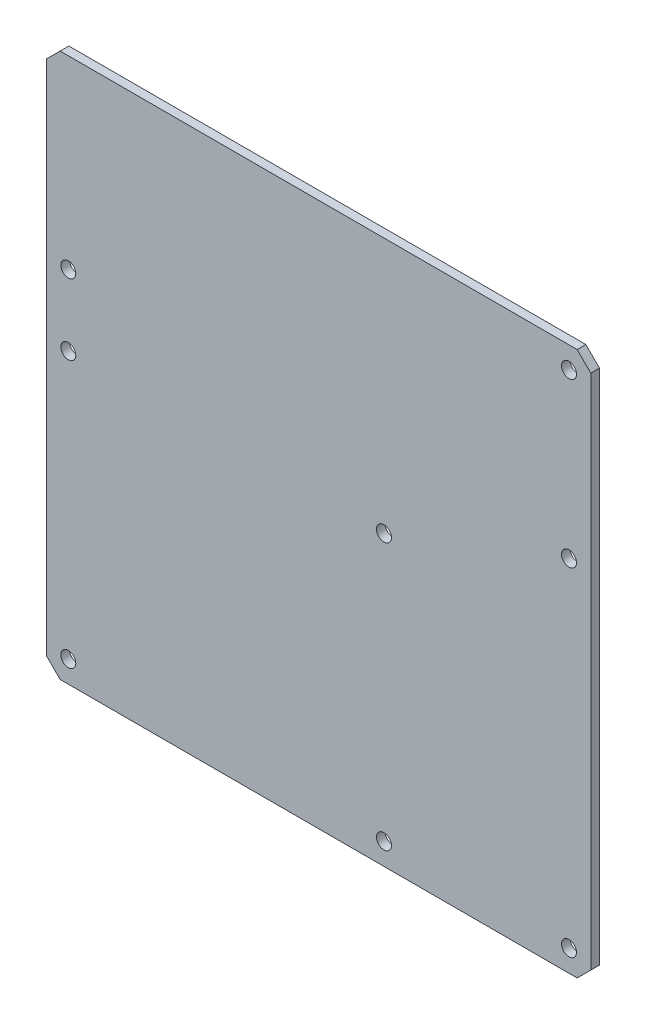
ISO-10303-21;
HEADER;
FILE_DESCRIPTION(('STEP AP214'),'2;1');
FILE_NAME('part.step','',(''),(''),'','','');
FILE_SCHEMA(('AUTOMOTIVE_DESIGN { 1 0 10303 214 1 1 1 1 }'));
ENDSEC;
DATA;
#1=APPLICATION_CONTEXT('core data for automotive mechanical design processes');
#2=APPLICATION_PROTOCOL_DEFINITION('international standard','automotive_design',2000,#1);
#3=PRODUCT_CONTEXT('',#1,'mechanical');
#4=PRODUCT('Part','Part','',(#3));
#5=PRODUCT_RELATED_PRODUCT_CATEGORY('part','',(#4));
#6=PRODUCT_DEFINITION_FORMATION('','',#4);
#7=PRODUCT_DEFINITION_CONTEXT('part definition',#1,'design');
#8=PRODUCT_DEFINITION('design','',#6,#7);
#9=PRODUCT_DEFINITION_SHAPE('','',#8);
#10=(LENGTH_UNIT() NAMED_UNIT(*) SI_UNIT(.MILLI.,.METRE.));
#11=(NAMED_UNIT(*) PLANE_ANGLE_UNIT() SI_UNIT($,.RADIAN.));
#12=(NAMED_UNIT(*) SI_UNIT($,.STERADIAN.) SOLID_ANGLE_UNIT());
#13=UNCERTAINTY_MEASURE_WITH_UNIT(LENGTH_MEASURE(1.E-05),#10,'distance_accuracy_value','');
#14=(GEOMETRIC_REPRESENTATION_CONTEXT(3) GLOBAL_UNCERTAINTY_ASSIGNED_CONTEXT((#13)) GLOBAL_UNIT_ASSIGNED_CONTEXT((#10,
#11,#12)) REPRESENTATION_CONTEXT('',''));
#15=CARTESIAN_POINT('',(0.,0.,0.));
#16=DIRECTION('',(0.,0.,1.));
#17=DIRECTION('',(1.,0.,0.));
#18=AXIS2_PLACEMENT_3D('',#15,#16,#17);
#19=CARTESIAN_POINT('',(41.6323670908377,0.,1.6));
#20=DIRECTION('',(1.,0.,0.));
#21=DIRECTION('',(0.,1.,0.));
#22=AXIS2_PLACEMENT_3D('',#19,#20,#21);
#23=PLANE('',#22);
#24=DIRECTION('',(0.,-1.,0.));
#25=VECTOR('',#24,1.);
#26=CARTESIAN_POINT('',(41.6323670908377,0.,0.));
#27=LINE('',#26,#25);
#28=CARTESIAN_POINT('',(41.6323670908377,45.7222222222222,0.));
#29=VERTEX_POINT('',#28);
#30=CARTESIAN_POINT('',(41.6323670908377,-49.2777777777778,0.));
#31=VERTEX_POINT('',#30);
#32=EDGE_CURVE('E229',#29,#31,#27,.T.);
#33=ORIENTED_EDGE('',*,*,#32,.F.);
#34=DIRECTION('',(0.,0.,-1.));
#35=VECTOR('',#34,1.);
#36=CARTESIAN_POINT('',(41.6323670908377,45.7222222222222,1.6));
#37=LINE('',#36,#35);
#38=CARTESIAN_POINT('',(41.6323670908377,45.7222222222222,1.6));
#39=VERTEX_POINT('',#38);
#40=EDGE_CURVE('E12',#39,#29,#37,.T.);
#41=ORIENTED_EDGE('',*,*,#40,.F.);
#42=DIRECTION('',(0.,-1.,0.));
#43=VECTOR('',#42,1.);
#44=CARTESIAN_POINT('',(41.6323670908377,0.,1.6));
#45=LINE('',#44,#43);
#46=CARTESIAN_POINT('',(41.6323670908377,-49.2777777777778,1.6));
#47=VERTEX_POINT('',#46);
#48=EDGE_CURVE('E312',#39,#47,#45,.T.);
#49=ORIENTED_EDGE('',*,*,#48,.T.);
#50=DIRECTION('',(0.,0.,-1.));
#51=VECTOR('',#50,1.);
#52=CARTESIAN_POINT('',(41.6323670908377,-49.2777777777778,1.6));
#53=LINE('',#52,#51);
#54=EDGE_CURVE('E114',#47,#31,#53,.T.);
#55=ORIENTED_EDGE('',*,*,#54,.T.);
#56=EDGE_LOOP('',(#33,#41,#49,#55));
#57=FACE_BOUND('',#56,.T.);
#58=ADVANCED_FACE('F48',(#57),#23,.T.);
#59=CARTESIAN_POINT('',(43.6772946565299,43.67729465653,1.6));
#60=DIRECTION('',(-0.707106781186546,-0.707106781186548,0.));
#61=DIRECTION('',(0.707106781186549,-0.707106781186547,0.));
#62=AXIS2_PLACEMENT_3D('',#59,#60,#61);
#63=PLANE('',#62);
#64=DIRECTION('',(-0.707106781186549,0.707106781186547,0.));
#65=VECTOR('',#64,1.);
#66=CARTESIAN_POINT('',(43.6772946565299,43.67729465653,0.));
#67=LINE('',#66,#65);
#68=CARTESIAN_POINT('',(39.1323670908377,48.2222222222222,0.));
#69=VERTEX_POINT('',#68);
#70=EDGE_CURVE('E233',#29,#69,#67,.T.);
#71=ORIENTED_EDGE('',*,*,#70,.T.);
#72=DIRECTION('',(0.,0.,-1.));
#73=VECTOR('',#72,1.);
#74=CARTESIAN_POINT('',(39.1323670908377,48.2222222222222,1.6));
#75=LINE('',#74,#73);
#76=CARTESIAN_POINT('',(39.1323670908377,48.2222222222222,1.6));
#77=VERTEX_POINT('',#76);
#78=EDGE_CURVE('E59',#77,#69,#75,.T.);
#79=ORIENTED_EDGE('',*,*,#78,.F.);
#80=DIRECTION('',(-0.707106781186549,0.707106781186547,0.));
#81=VECTOR('',#80,1.);
#82=CARTESIAN_POINT('',(43.6772946565299,43.67729465653,1.6));
#83=LINE('',#82,#81);
#84=EDGE_CURVE('E307',#39,#77,#83,.T.);
#85=ORIENTED_EDGE('',*,*,#84,.F.);
#86=ORIENTED_EDGE('',*,*,#40,.T.);
#87=EDGE_LOOP('',(#71,#79,#85,#86));
#88=FACE_BOUND('',#87,.T.);
#89=ADVANCED_FACE('F285',(#88),#63,.F.);
#90=CARTESIAN_POINT('',(0.,48.2222222222222,1.6));
#91=DIRECTION('',(0.,1.,0.));
#92=DIRECTION('',(0.,0.,1.));
#93=AXIS2_PLACEMENT_3D('',#90,#91,#92);
#94=PLANE('',#93);
#95=DIRECTION('',(1.,0.,0.));
#96=VECTOR('',#95,1.);
#97=CARTESIAN_POINT('',(0.,48.2222222222222,0.));
#98=LINE('',#97,#96);
#99=CARTESIAN_POINT('',(-55.8676329091623,48.2222222222222,0.));
#100=VERTEX_POINT('',#99);
#101=EDGE_CURVE('E279',#100,#69,#98,.T.);
#102=ORIENTED_EDGE('',*,*,#101,.F.);
#103=DIRECTION('',(0.,0.,-1.));
#104=VECTOR('',#103,1.);
#105=CARTESIAN_POINT('',(-55.8676329091623,48.2222222222222,1.6));
#106=LINE('',#105,#104);
#107=CARTESIAN_POINT('',(-55.8676329091623,48.2222222222222,1.6));
#108=VERTEX_POINT('',#107);
#109=EDGE_CURVE('E263',#108,#100,#106,.T.);
#110=ORIENTED_EDGE('',*,*,#109,.F.);
#111=DIRECTION('',(1.,0.,0.));
#112=VECTOR('',#111,1.);
#113=CARTESIAN_POINT('',(0.,48.2222222222222,1.6));
#114=LINE('',#113,#112);
#115=EDGE_CURVE('E282',#108,#77,#114,.T.);
#116=ORIENTED_EDGE('',*,*,#115,.T.);
#117=ORIENTED_EDGE('',*,*,#78,.T.);
#118=EDGE_LOOP('',(#102,#110,#116,#117));
#119=FACE_BOUND('',#118,.T.);
#120=ADVANCED_FACE('F277',(#119),#94,.T.);
#121=CARTESIAN_POINT('',(-52.0449275656923,52.0449275656923,1.6));
#122=DIRECTION('',(-0.707106781186548,0.707106781186548,0.));
#123=DIRECTION('',(-0.707106781186548,-0.707106781186548,0.));
#124=AXIS2_PLACEMENT_3D('',#121,#122,#123);
#125=PLANE('',#124);
#126=DIRECTION('',(0.707106781186548,0.707106781186548,0.));
#127=VECTOR('',#126,1.);
#128=CARTESIAN_POINT('',(-52.0449275656923,52.0449275656923,0.));
#129=LINE('',#128,#127);
#130=CARTESIAN_POINT('',(-58.3676329091623,45.7222222222222,0.));
#131=VERTEX_POINT('',#130);
#132=EDGE_CURVE('E289',#131,#100,#129,.T.);
#133=ORIENTED_EDGE('',*,*,#132,.F.);
#134=DIRECTION('',(0.,0.,-1.));
#135=VECTOR('',#134,1.);
#136=CARTESIAN_POINT('',(-58.3676329091623,45.7222222222222,1.6));
#137=LINE('',#136,#135);
#138=CARTESIAN_POINT('',(-58.3676329091623,45.7222222222222,1.6));
#139=VERTEX_POINT('',#138);
#140=EDGE_CURVE('E266',#139,#131,#137,.T.);
#141=ORIENTED_EDGE('',*,*,#140,.F.);
#142=DIRECTION('',(0.707106781186548,0.707106781186548,0.));
#143=VECTOR('',#142,1.);
#144=CARTESIAN_POINT('',(-52.0449275656923,52.0449275656923,1.6));
#145=LINE('',#144,#143);
#146=EDGE_CURVE('E164',#139,#108,#145,.T.);
#147=ORIENTED_EDGE('',*,*,#146,.T.);
#148=ORIENTED_EDGE('',*,*,#109,.T.);
#149=EDGE_LOOP('',(#133,#141,#147,#148));
#150=FACE_BOUND('',#149,.T.);
#151=ADVANCED_FACE('F305',(#150),#125,.T.);
#152=CARTESIAN_POINT('',(-58.3676329091623,0.,1.6));
#153=DIRECTION('',(1.,0.,0.));
#154=DIRECTION('',(0.,0.,-1.));
#155=AXIS2_PLACEMENT_3D('',#152,#153,#154);
#156=PLANE('',#155);
#157=DIRECTION('',(0.,-1.,0.));
#158=VECTOR('',#157,1.);
#159=CARTESIAN_POINT('',(-58.3676329091623,0.,0.));
#160=LINE('',#159,#158);
#161=CARTESIAN_POINT('',(-58.3676329091623,-49.2777777777778,0.));
#162=VERTEX_POINT('',#161);
#163=EDGE_CURVE('E292',#131,#162,#160,.T.);
#164=ORIENTED_EDGE('',*,*,#163,.T.);
#165=DIRECTION('',(0.,0.,-1.));
#166=VECTOR('',#165,1.);
#167=CARTESIAN_POINT('',(-58.3676329091623,-49.2777777777778,1.6));
#168=LINE('',#167,#166);
#169=CARTESIAN_POINT('',(-58.3676329091623,-49.2777777777778,1.6));
#170=VERTEX_POINT('',#169);
#171=EDGE_CURVE('E148',#170,#162,#168,.T.);
#172=ORIENTED_EDGE('',*,*,#171,.F.);
#173=DIRECTION('',(0.,-1.,0.));
#174=VECTOR('',#173,1.);
#175=CARTESIAN_POINT('',(-58.3676329091623,0.,1.6));
#176=LINE('',#175,#174);
#177=EDGE_CURVE('E159',#139,#170,#176,.T.);
#178=ORIENTED_EDGE('',*,*,#177,.F.);
#179=ORIENTED_EDGE('',*,*,#140,.T.);
#180=EDGE_LOOP('',(#164,#172,#178,#179));
#181=FACE_BOUND('',#180,.T.);
#182=ADVANCED_FACE('F466',(#181),#156,.F.);
#183=CARTESIAN_POINT('',(-53.82270534347,-53.82270534347,1.6));
#184=DIRECTION('',(-0.707106781186548,-0.707106781186548,0.));
#185=DIRECTION('',(0.707106781186548,-0.707106781186548,0.));
#186=AXIS2_PLACEMENT_3D('',#183,#184,#185);
#187=PLANE('',#186);
#188=DIRECTION('',(-0.707106781186548,0.707106781186548,0.));
#189=VECTOR('',#188,1.);
#190=CARTESIAN_POINT('',(-53.82270534347,-53.82270534347,0.));
#191=LINE('',#190,#189);
#192=CARTESIAN_POINT('',(-55.8676329091623,-51.7777777777778,0.));
#193=VERTEX_POINT('',#192);
#194=EDGE_CURVE('E144',#193,#162,#191,.T.);
#195=ORIENTED_EDGE('',*,*,#194,.F.);
#196=DIRECTION('',(0.,0.,-1.));
#197=VECTOR('',#196,1.);
#198=CARTESIAN_POINT('',(-55.8676329091623,-51.7777777777778,1.6));
#199=LINE('',#198,#197);
#200=CARTESIAN_POINT('',(-55.8676329091623,-51.7777777777778,1.6));
#201=VERTEX_POINT('',#200);
#202=EDGE_CURVE('E138',#201,#193,#199,.T.);
#203=ORIENTED_EDGE('',*,*,#202,.F.);
#204=DIRECTION('',(-0.707106781186548,0.707106781186548,0.));
#205=VECTOR('',#204,1.);
#206=CARTESIAN_POINT('',(-53.82270534347,-53.82270534347,1.6));
#207=LINE('',#206,#205);
#208=EDGE_CURVE('E142',#201,#170,#207,.T.);
#209=ORIENTED_EDGE('',*,*,#208,.T.);
#210=ORIENTED_EDGE('',*,*,#171,.T.);
#211=EDGE_LOOP('',(#195,#203,#209,#210));
#212=FACE_BOUND('',#211,.T.);
#213=ADVANCED_FACE('F140',(#212),#187,.T.);
#214=CARTESIAN_POINT('',(0.,-51.7777777777778,1.6));
#215=DIRECTION('',(0.,1.,0.));
#216=DIRECTION('',(0.,0.,1.));
#217=AXIS2_PLACEMENT_3D('',#214,#215,#216);
#218=PLANE('',#217);
#219=DIRECTION('',(1.,0.,0.));
#220=VECTOR('',#219,1.);
#221=CARTESIAN_POINT('',(0.,-51.7777777777778,0.));
#222=LINE('',#221,#220);
#223=CARTESIAN_POINT('',(39.1323670908377,-51.7777777777778,0.));
#224=VERTEX_POINT('',#223);
#225=EDGE_CURVE('E241',#193,#224,#222,.T.);
#226=ORIENTED_EDGE('',*,*,#225,.T.);
#227=DIRECTION('',(0.,0.,-1.));
#228=VECTOR('',#227,1.);
#229=CARTESIAN_POINT('',(39.1323670908377,-51.7777777777778,1.6));
#230=LINE('',#229,#228);
#231=CARTESIAN_POINT('',(39.1323670908377,-51.7777777777778,1.6));
#232=VERTEX_POINT('',#231);
#233=EDGE_CURVE('E149',#232,#224,#230,.T.);
#234=ORIENTED_EDGE('',*,*,#233,.F.);
#235=DIRECTION('',(1.,0.,0.));
#236=VECTOR('',#235,1.);
#237=CARTESIAN_POINT('',(0.,-51.7777777777778,1.6));
#238=LINE('',#237,#236);
#239=EDGE_CURVE('E152',#201,#232,#238,.T.);
#240=ORIENTED_EDGE('',*,*,#239,.F.);
#241=ORIENTED_EDGE('',*,*,#202,.T.);
#242=EDGE_LOOP('',(#226,#234,#240,#241));
#243=FACE_BOUND('',#242,.T.);
#244=ADVANCED_FACE('F153',(#243),#218,.F.);
#245=CARTESIAN_POINT('',(-54.3676329091623,-47.7777777777778,1.6));
#246=DIRECTION('',(0.,0.,-1.));
#247=DIRECTION('',(-1.,0.,0.));
#248=AXIS2_PLACEMENT_3D('',#245,#246,#247);
#249=CYLINDRICAL_SURFACE('',#248,1.375);
#250=CARTESIAN_POINT('',(-54.3676329091623,-47.7777777777778,1.6));
#251=DIRECTION('',(0.,0.,1.));
#252=DIRECTION('',(1.,0.,0.));
#253=AXIS2_PLACEMENT_3D('',#250,#251,#252);
#254=CIRCLE('',#253,1.375);
#255=CARTESIAN_POINT('',(-52.9926329091623,-47.7777777777778,1.6));
#256=VERTEX_POINT('',#255);
#257=EDGE_CURVE('E326',#256,#256,#254,.T.);
#258=ORIENTED_EDGE('',*,*,#257,.T.);
#259=EDGE_LOOP('',(#258));
#260=FACE_BOUND('',#259,.T.);
#261=CARTESIAN_POINT('',(-54.3676329091623,-47.7777777777778,0.));
#262=DIRECTION('',(0.,0.,1.));
#263=DIRECTION('',(1.,0.,0.));
#264=AXIS2_PLACEMENT_3D('',#261,#262,#263);
#265=CIRCLE('',#264,1.375);
#266=CARTESIAN_POINT('',(-52.9926329091623,-47.7777777777778,0.));
#267=VERTEX_POINT('',#266);
#268=EDGE_CURVE('E224',#267,#267,#265,.T.);
#269=ORIENTED_EDGE('',*,*,#268,.F.);
#270=EDGE_LOOP('',(#269));
#271=FACE_BOUND('',#270,.T.);
#272=ADVANCED_FACE('F392',(#260,#271),#249,.F.);
#273=CARTESIAN_POINT('',(3.63236709083768,-47.7777777777778,1.6));
#274=DIRECTION('',(0.,0.,-1.));
#275=DIRECTION('',(-1.,0.,0.));
#276=AXIS2_PLACEMENT_3D('',#273,#274,#275);
#277=CYLINDRICAL_SURFACE('',#276,1.375);
#278=CARTESIAN_POINT('',(3.63236709083768,-47.7777777777778,1.6));
#279=DIRECTION('',(0.,0.,1.));
#280=DIRECTION('',(1.,0.,0.));
#281=AXIS2_PLACEMENT_3D('',#278,#279,#280);
#282=CIRCLE('',#281,1.375);
#283=CARTESIAN_POINT('',(5.00736709083767,-47.7777777777778,1.6));
#284=VERTEX_POINT('',#283);
#285=EDGE_CURVE('E330',#284,#284,#282,.T.);
#286=ORIENTED_EDGE('',*,*,#285,.T.);
#287=EDGE_LOOP('',(#286));
#288=FACE_BOUND('',#287,.T.);
#289=CARTESIAN_POINT('',(3.63236709083768,-47.7777777777778,0.));
#290=DIRECTION('',(0.,0.,1.));
#291=DIRECTION('',(1.,0.,0.));
#292=AXIS2_PLACEMENT_3D('',#289,#290,#291);
#293=CIRCLE('',#292,1.375);
#294=CARTESIAN_POINT('',(5.00736709083767,-47.7777777777778,0.));
#295=VERTEX_POINT('',#294);
#296=EDGE_CURVE('E220',#295,#295,#293,.T.);
#297=ORIENTED_EDGE('',*,*,#296,.F.);
#298=EDGE_LOOP('',(#297));
#299=FACE_BOUND('',#298,.T.);
#300=ADVANCED_FACE('F395',(#288,#299),#277,.F.);
#301=CARTESIAN_POINT('',(3.63236709083767,1.22222222222222,1.6));
#302=DIRECTION('',(0.,0.,-1.));
#303=DIRECTION('',(-1.,0.,0.));
#304=AXIS2_PLACEMENT_3D('',#301,#302,#303);
#305=CYLINDRICAL_SURFACE('',#304,1.375);
#306=CARTESIAN_POINT('',(3.63236709083767,1.22222222222222,1.6));
#307=DIRECTION('',(0.,0.,1.));
#308=DIRECTION('',(1.,0.,0.));
#309=AXIS2_PLACEMENT_3D('',#306,#307,#308);
#310=CIRCLE('',#309,1.375);
#311=CARTESIAN_POINT('',(5.00736709083767,1.22222222222222,1.6));
#312=VERTEX_POINT('',#311);
#313=EDGE_CURVE('E335',#312,#312,#310,.T.);
#314=ORIENTED_EDGE('',*,*,#313,.T.);
#315=EDGE_LOOP('',(#314));
#316=FACE_BOUND('',#315,.T.);
#317=CARTESIAN_POINT('',(3.63236709083767,1.22222222222222,0.));
#318=DIRECTION('',(0.,0.,1.));
#319=DIRECTION('',(1.,0.,0.));
#320=AXIS2_PLACEMENT_3D('',#317,#318,#319);
#321=CIRCLE('',#320,1.375);
#322=CARTESIAN_POINT('',(5.00736709083767,1.22222222222222,0.));
#323=VERTEX_POINT('',#322);
#324=EDGE_CURVE('E212',#323,#323,#321,.T.);
#325=ORIENTED_EDGE('',*,*,#324,.F.);
#326=EDGE_LOOP('',(#325));
#327=FACE_BOUND('',#326,.T.);
#328=ADVANCED_FACE('F426',(#316,#327),#305,.F.);
#329=CARTESIAN_POINT('',(-54.3676329091623,1.22222222222222,1.6));
#330=DIRECTION('',(0.,0.,-1.));
#331=DIRECTION('',(-1.,0.,0.));
#332=AXIS2_PLACEMENT_3D('',#329,#330,#331);
#333=CYLINDRICAL_SURFACE('',#332,1.375);
#334=CARTESIAN_POINT('',(-54.3676329091623,1.22222222222222,1.6));
#335=DIRECTION('',(0.,0.,1.));
#336=DIRECTION('',(1.,0.,0.));
#337=AXIS2_PLACEMENT_3D('',#334,#335,#336);
#338=CIRCLE('',#337,1.375);
#339=CARTESIAN_POINT('',(-52.9926329091623,1.22222222222222,1.6));
#340=VERTEX_POINT('',#339);
#341=EDGE_CURVE('E343',#340,#340,#338,.T.);
#342=ORIENTED_EDGE('',*,*,#341,.T.);
#343=EDGE_LOOP('',(#342));
#344=FACE_BOUND('',#343,.T.);
#345=CARTESIAN_POINT('',(-54.3676329091623,1.22222222222222,0.));
#346=DIRECTION('',(0.,0.,1.));
#347=DIRECTION('',(1.,0.,0.));
#348=AXIS2_PLACEMENT_3D('',#345,#346,#347);
#349=CIRCLE('',#348,1.375);
#350=CARTESIAN_POINT('',(-52.9926329091623,1.22222222222222,0.));
#351=VERTEX_POINT('',#350);
#352=EDGE_CURVE('E207',#351,#351,#349,.T.);
#353=ORIENTED_EDGE('',*,*,#352,.F.);
#354=EDGE_LOOP('',(#353));
#355=FACE_BOUND('',#354,.T.);
#356=ADVANCED_FACE('F430',(#344,#355),#333,.F.);
#357=CARTESIAN_POINT('',(37.6323670908377,-47.7777777777778,1.6));
#358=DIRECTION('',(0.,0.,-1.));
#359=DIRECTION('',(-1.,0.,0.));
#360=AXIS2_PLACEMENT_3D('',#357,#358,#359);
#361=CYLINDRICAL_SURFACE('',#360,1.375);
#362=CARTESIAN_POINT('',(37.6323670908377,-47.7777777777778,1.6));
#363=DIRECTION('',(0.,0.,1.));
#364=DIRECTION('',(1.,0.,0.));
#365=AXIS2_PLACEMENT_3D('',#362,#363,#364);
#366=CIRCLE('',#365,1.375);
#367=CARTESIAN_POINT('',(39.0073670908377,-47.7777777777778,1.6));
#368=VERTEX_POINT('',#367);
#369=EDGE_CURVE('E347',#368,#368,#366,.T.);
#370=ORIENTED_EDGE('',*,*,#369,.T.);
#371=EDGE_LOOP('',(#370));
#372=FACE_BOUND('',#371,.T.);
#373=CARTESIAN_POINT('',(37.6323670908377,-47.7777777777778,0.));
#374=DIRECTION('',(0.,0.,1.));
#375=DIRECTION('',(1.,0.,0.));
#376=AXIS2_PLACEMENT_3D('',#373,#374,#375);
#377=CIRCLE('',#376,1.375);
#378=CARTESIAN_POINT('',(39.0073670908377,-47.7777777777778,0.));
#379=VERTEX_POINT('',#378);
#380=EDGE_CURVE('E202',#379,#379,#377,.T.);
#381=ORIENTED_EDGE('',*,*,#380,.F.);
#382=EDGE_LOOP('',(#381));
#383=FACE_BOUND('',#382,.T.);
#384=ADVANCED_FACE('F436',(#372,#383),#361,.F.);
#385=CARTESIAN_POINT('',(-54.3676329091623,14.2222222222222,1.6));
#386=DIRECTION('',(0.,0.,-1.));
#387=DIRECTION('',(-1.,0.,0.));
#388=AXIS2_PLACEMENT_3D('',#385,#386,#387);
#389=CYLINDRICAL_SURFACE('',#388,1.375);
#390=CARTESIAN_POINT('',(-54.3676329091623,14.2222222222222,1.6));
#391=DIRECTION('',(0.,0.,1.));
#392=DIRECTION('',(1.,0.,0.));
#393=AXIS2_PLACEMENT_3D('',#390,#391,#392);
#394=CIRCLE('',#393,1.375);
#395=CARTESIAN_POINT('',(-52.9926329091623,14.2222222222222,1.6));
#396=VERTEX_POINT('',#395);
#397=EDGE_CURVE('E352',#396,#396,#394,.T.);
#398=ORIENTED_EDGE('',*,*,#397,.T.);
#399=EDGE_LOOP('',(#398));
#400=FACE_BOUND('',#399,.T.);
#401=CARTESIAN_POINT('',(-54.3676329091623,14.2222222222222,0.));
#402=DIRECTION('',(0.,0.,1.));
#403=DIRECTION('',(1.,0.,0.));
#404=AXIS2_PLACEMENT_3D('',#401,#402,#403);
#405=CIRCLE('',#404,1.375);
#406=CARTESIAN_POINT('',(-52.9926329091623,14.2222222222222,0.));
#407=VERTEX_POINT('',#406);
#408=EDGE_CURVE('E198',#407,#407,#405,.T.);
#409=ORIENTED_EDGE('',*,*,#408,.F.);
#410=EDGE_LOOP('',(#409));
#411=FACE_BOUND('',#410,.T.);
#412=ADVANCED_FACE('F441',(#400,#411),#389,.F.);
#413=CARTESIAN_POINT('',(37.6323670908377,14.2222222222222,1.6));
#414=DIRECTION('',(0.,0.,-1.));
#415=DIRECTION('',(-1.,0.,0.));
#416=AXIS2_PLACEMENT_3D('',#413,#414,#415);
#417=CYLINDRICAL_SURFACE('',#416,1.375);
#418=CARTESIAN_POINT('',(37.6323670908377,14.2222222222222,1.6));
#419=DIRECTION('',(0.,0.,1.));
#420=DIRECTION('',(1.,0.,0.));
#421=AXIS2_PLACEMENT_3D('',#418,#419,#420);
#422=CIRCLE('',#421,1.375);
#423=CARTESIAN_POINT('',(39.0073670908377,14.2222222222222,1.6));
#424=VERTEX_POINT('',#423);
#425=EDGE_CURVE('E357',#424,#424,#422,.T.);
#426=ORIENTED_EDGE('',*,*,#425,.T.);
#427=EDGE_LOOP('',(#426));
#428=FACE_BOUND('',#427,.T.);
#429=CARTESIAN_POINT('',(37.6323670908377,14.2222222222222,0.));
#430=DIRECTION('',(0.,0.,1.));
#431=DIRECTION('',(1.,0.,0.));
#432=AXIS2_PLACEMENT_3D('',#429,#430,#431);
#433=CIRCLE('',#432,1.375);
#434=CARTESIAN_POINT('',(39.0073670908377,14.2222222222222,0.));
#435=VERTEX_POINT('',#434);
#436=EDGE_CURVE('E187',#435,#435,#433,.T.);
#437=ORIENTED_EDGE('',*,*,#436,.F.);
#438=EDGE_LOOP('',(#437));
#439=FACE_BOUND('',#438,.T.);
#440=ADVANCED_FACE('F371',(#428,#439),#417,.F.);
#441=CARTESIAN_POINT('',(37.6323670908377,44.2222222222222,1.6));
#442=DIRECTION('',(0.,0.,-1.));
#443=DIRECTION('',(-1.,0.,0.));
#444=AXIS2_PLACEMENT_3D('',#441,#442,#443);
#445=CYLINDRICAL_SURFACE('',#444,1.375);
#446=CARTESIAN_POINT('',(37.6323670908377,44.2222222222222,1.6));
#447=DIRECTION('',(0.,0.,1.));
#448=DIRECTION('',(1.,0.,0.));
#449=AXIS2_PLACEMENT_3D('',#446,#447,#448);
#450=CIRCLE('',#449,1.375);
#451=CARTESIAN_POINT('',(39.0073670908377,44.2222222222222,1.6));
#452=VERTEX_POINT('',#451);
#453=EDGE_CURVE('E249',#452,#452,#450,.T.);
#454=ORIENTED_EDGE('',*,*,#453,.T.);
#455=EDGE_LOOP('',(#454));
#456=FACE_BOUND('',#455,.T.);
#457=CARTESIAN_POINT('',(37.6323670908377,44.2222222222222,0.));
#458=DIRECTION('',(0.,0.,1.));
#459=DIRECTION('',(1.,0.,0.));
#460=AXIS2_PLACEMENT_3D('',#457,#458,#459);
#461=CIRCLE('',#460,1.375);
#462=CARTESIAN_POINT('',(39.0073670908377,44.2222222222222,0.));
#463=VERTEX_POINT('',#462);
#464=EDGE_CURVE('E182',#463,#463,#461,.T.);
#465=ORIENTED_EDGE('',*,*,#464,.F.);
#466=EDGE_LOOP('',(#465));
#467=FACE_BOUND('',#466,.T.);
#468=ADVANCED_FACE('F51',(#456,#467),#445,.F.);
#469=CARTESIAN_POINT('',(45.4550724343077,-45.4550724343077,1.6));
#470=DIRECTION('',(-0.707106781186548,0.707106781186548,0.));
#471=DIRECTION('',(-0.707106781186548,-0.707106781186548,0.));
#472=AXIS2_PLACEMENT_3D('',#469,#470,#471);
#473=PLANE('',#472);
#474=DIRECTION('',(0.707106781186548,0.707106781186548,0.));
#475=VECTOR('',#474,1.);
#476=CARTESIAN_POINT('',(45.4550724343077,-45.4550724343077,0.));
#477=LINE('',#476,#475);
#478=EDGE_CURVE('E107',#224,#31,#477,.T.);
#479=ORIENTED_EDGE('',*,*,#478,.T.);
#480=ORIENTED_EDGE('',*,*,#54,.F.);
#481=DIRECTION('',(0.707106781186548,0.707106781186548,0.));
#482=VECTOR('',#481,1.);
#483=CARTESIAN_POINT('',(45.4550724343077,-45.4550724343077,1.6));
#484=LINE('',#483,#482);
#485=EDGE_CURVE('E70',#232,#47,#484,.T.);
#486=ORIENTED_EDGE('',*,*,#485,.F.);
#487=ORIENTED_EDGE('',*,*,#233,.T.);
#488=EDGE_LOOP('',(#479,#480,#486,#487));
#489=FACE_BOUND('',#488,.T.);
#490=ADVANCED_FACE('F376',(#489),#473,.F.);
#491=CARTESIAN_POINT('',(0.,0.,1.6));
#492=DIRECTION('',(0.,0.,1.));
#493=DIRECTION('',(1.,0.,0.));
#494=AXIS2_PLACEMENT_3D('',#491,#492,#493);
#495=PLANE('',#494);
#496=ORIENTED_EDGE('',*,*,#453,.F.);
#497=EDGE_LOOP('',(#496));
#498=FACE_BOUND('',#497,.T.);
#499=ORIENTED_EDGE('',*,*,#425,.F.);
#500=EDGE_LOOP('',(#499));
#501=FACE_BOUND('',#500,.T.);
#502=ORIENTED_EDGE('',*,*,#397,.F.);
#503=EDGE_LOOP('',(#502));
#504=FACE_BOUND('',#503,.T.);
#505=ORIENTED_EDGE('',*,*,#369,.F.);
#506=EDGE_LOOP('',(#505));
#507=FACE_BOUND('',#506,.T.);
#508=ORIENTED_EDGE('',*,*,#341,.F.);
#509=EDGE_LOOP('',(#508));
#510=FACE_BOUND('',#509,.T.);
#511=ORIENTED_EDGE('',*,*,#313,.F.);
#512=EDGE_LOOP('',(#511));
#513=FACE_BOUND('',#512,.T.);
#514=ORIENTED_EDGE('',*,*,#285,.F.);
#515=EDGE_LOOP('',(#514));
#516=FACE_BOUND('',#515,.T.);
#517=ORIENTED_EDGE('',*,*,#257,.F.);
#518=EDGE_LOOP('',(#517));
#519=FACE_BOUND('',#518,.T.);
#520=ORIENTED_EDGE('',*,*,#48,.F.);
#521=ORIENTED_EDGE('',*,*,#84,.T.);
#522=ORIENTED_EDGE('',*,*,#115,.F.);
#523=ORIENTED_EDGE('',*,*,#146,.F.);
#524=ORIENTED_EDGE('',*,*,#177,.T.);
#525=ORIENTED_EDGE('',*,*,#208,.F.);
#526=ORIENTED_EDGE('',*,*,#239,.T.);
#527=ORIENTED_EDGE('',*,*,#485,.T.);
#528=EDGE_LOOP('',(#520,#521,#522,#523,#524,#525,#526,#527));
#529=FACE_BOUND('',#528,.T.);
#530=ADVANCED_FACE('F156',(#498,#501,#504,#507,#510,#513,#516,#519,#529),#495,.T.);
#531=CARTESIAN_POINT('',(0.,0.,0.));
#532=DIRECTION('',(0.,0.,1.));
#533=DIRECTION('',(1.,0.,0.));
#534=AXIS2_PLACEMENT_3D('',#531,#532,#533);
#535=PLANE('',#534);
#536=ORIENTED_EDGE('',*,*,#464,.T.);
#537=EDGE_LOOP('',(#536));
#538=FACE_BOUND('',#537,.T.);
#539=ORIENTED_EDGE('',*,*,#436,.T.);
#540=EDGE_LOOP('',(#539));
#541=FACE_BOUND('',#540,.T.);
#542=ORIENTED_EDGE('',*,*,#408,.T.);
#543=EDGE_LOOP('',(#542));
#544=FACE_BOUND('',#543,.T.);
#545=ORIENTED_EDGE('',*,*,#380,.T.);
#546=EDGE_LOOP('',(#545));
#547=FACE_BOUND('',#546,.T.);
#548=ORIENTED_EDGE('',*,*,#352,.T.);
#549=EDGE_LOOP('',(#548));
#550=FACE_BOUND('',#549,.T.);
#551=ORIENTED_EDGE('',*,*,#324,.T.);
#552=EDGE_LOOP('',(#551));
#553=FACE_BOUND('',#552,.T.);
#554=ORIENTED_EDGE('',*,*,#296,.T.);
#555=EDGE_LOOP('',(#554));
#556=FACE_BOUND('',#555,.T.);
#557=ORIENTED_EDGE('',*,*,#268,.T.);
#558=EDGE_LOOP('',(#557));
#559=FACE_BOUND('',#558,.T.);
#560=ORIENTED_EDGE('',*,*,#32,.T.);
#561=ORIENTED_EDGE('',*,*,#478,.F.);
#562=ORIENTED_EDGE('',*,*,#225,.F.);
#563=ORIENTED_EDGE('',*,*,#194,.T.);
#564=ORIENTED_EDGE('',*,*,#163,.F.);
#565=ORIENTED_EDGE('',*,*,#132,.T.);
#566=ORIENTED_EDGE('',*,*,#101,.T.);
#567=ORIENTED_EDGE('',*,*,#70,.F.);
#568=EDGE_LOOP('',(#560,#561,#562,#563,#564,#565,#566,#567));
#569=FACE_BOUND('',#568,.T.);
#570=ADVANCED_FACE('F286',(#538,#541,#544,#547,#550,#553,#556,#559,#569),#535,.F.);
#571=CLOSED_SHELL('',(#58,#89,#120,#151,#182,#213,#244,#272,#300,#328,#356,#384,#412,#440,#468,
#490,#530,#570));
#572=MANIFOLD_SOLID_BREP('B2',#571);
#573=ADVANCED_BREP_SHAPE_REPRESENTATION('',(#18,#572),#14);
#574=SHAPE_DEFINITION_REPRESENTATION(#9,#573);
ENDSEC;
END-ISO-10303-21;
